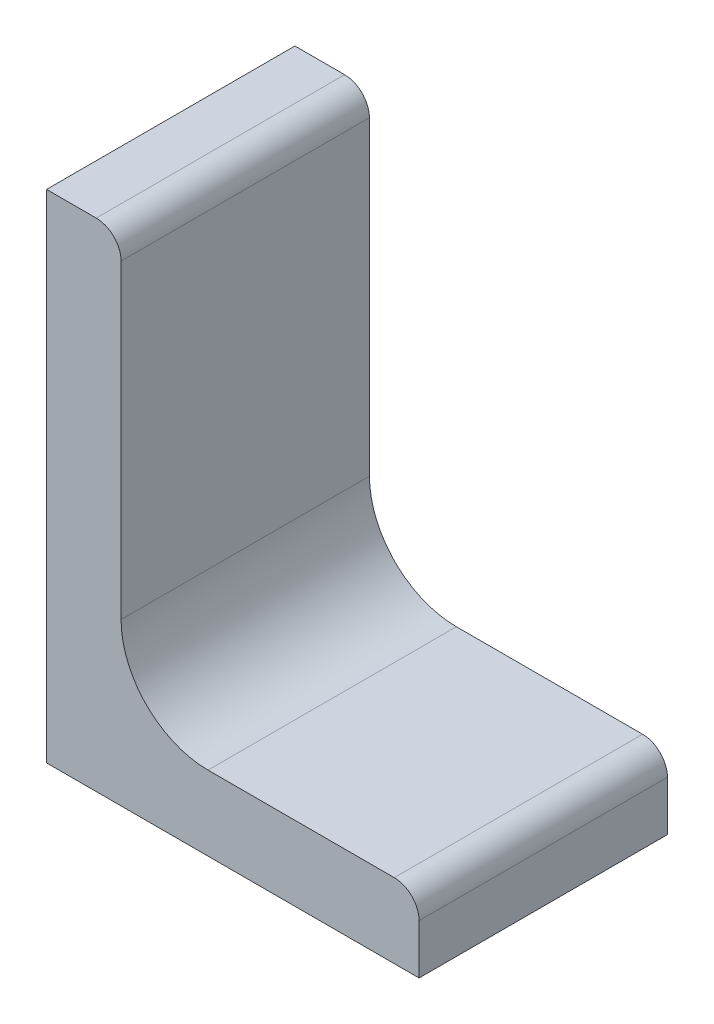
ISO-10303-21;
HEADER;
FILE_DESCRIPTION(('STEP AP214'),'2;1');
FILE_NAME('part.step','',(''),(''),'','','');
FILE_SCHEMA(('AUTOMOTIVE_DESIGN { 1 0 10303 214 1 1 1 1 }'));
ENDSEC;
DATA;
#1=APPLICATION_CONTEXT('core data for automotive mechanical design processes');
#2=APPLICATION_PROTOCOL_DEFINITION('international standard','automotive_design',2000,#1);
#3=PRODUCT_CONTEXT('',#1,'mechanical');
#4=PRODUCT('Part','Part','',(#3));
#5=PRODUCT_RELATED_PRODUCT_CATEGORY('part','',(#4));
#6=PRODUCT_DEFINITION_FORMATION('','',#4);
#7=PRODUCT_DEFINITION_CONTEXT('part definition',#1,'design');
#8=PRODUCT_DEFINITION('design','',#6,#7);
#9=PRODUCT_DEFINITION_SHAPE('','',#8);
#10=(LENGTH_UNIT() NAMED_UNIT(*) SI_UNIT(.MILLI.,.METRE.));
#11=(NAMED_UNIT(*) PLANE_ANGLE_UNIT() SI_UNIT($,.RADIAN.));
#12=(NAMED_UNIT(*) SI_UNIT($,.STERADIAN.) SOLID_ANGLE_UNIT());
#13=UNCERTAINTY_MEASURE_WITH_UNIT(LENGTH_MEASURE(1.E-05),#10,'distance_accuracy_value','');
#14=(GEOMETRIC_REPRESENTATION_CONTEXT(3) GLOBAL_UNCERTAINTY_ASSIGNED_CONTEXT((#13)) GLOBAL_UNIT_ASSIGNED_CONTEXT((#10,
#11,#12)) REPRESENTATION_CONTEXT('',''));
#15=CARTESIAN_POINT('',(0.,0.,0.));
#16=DIRECTION('',(0.,0.,1.));
#17=DIRECTION('',(1.,0.,0.));
#18=AXIS2_PLACEMENT_3D('',#15,#16,#17);
#19=CARTESIAN_POINT('',(3.,20.,10.));
#20=DIRECTION('',(0.,1.,0.));
#21=DIRECTION('',(0.,0.,1.));
#22=AXIS2_PLACEMENT_3D('',#19,#20,#21);
#23=PLANE('',#22);
#24=DIRECTION('',(1.,0.,0.));
#25=VECTOR('',#24,1.);
#26=CARTESIAN_POINT('',(3.,20.,10.));
#27=LINE('',#26,#25);
#28=CARTESIAN_POINT('',(0.,20.,10.));
#29=VERTEX_POINT('',#28);
#30=CARTESIAN_POINT('',(2.,20.,10.));
#31=VERTEX_POINT('',#30);
#32=EDGE_CURVE('E148',#29,#31,#27,.T.);
#33=ORIENTED_EDGE('',*,*,#32,.T.);
#34=DIRECTION('',(0.,0.,-1.));
#35=VECTOR('',#34,1.);
#36=CARTESIAN_POINT('',(2.,20.,10.));
#37=LINE('',#36,#35);
#38=CARTESIAN_POINT('',(2.,20.,0.));
#39=VERTEX_POINT('',#38);
#40=EDGE_CURVE('E164',#31,#39,#37,.T.);
#41=ORIENTED_EDGE('',*,*,#40,.T.);
#42=DIRECTION('',(1.,0.,0.));
#43=VECTOR('',#42,1.);
#44=CARTESIAN_POINT('',(3.,20.,0.));
#45=LINE('',#44,#43);
#46=CARTESIAN_POINT('',(0.,20.,0.));
#47=VERTEX_POINT('',#46);
#48=EDGE_CURVE('E135',#47,#39,#45,.T.);
#49=ORIENTED_EDGE('',*,*,#48,.F.);
#50=DIRECTION('',(0.,0.,-1.));
#51=VECTOR('',#50,1.);
#52=CARTESIAN_POINT('',(0.,20.,10.));
#53=LINE('',#52,#51);
#54=EDGE_CURVE('E149',#29,#47,#53,.T.);
#55=ORIENTED_EDGE('',*,*,#54,.F.);
#56=EDGE_LOOP('',(#33,#41,#49,#55));
#57=FACE_BOUND('',#56,.T.);
#58=ADVANCED_FACE('F35',(#57),#23,.T.);
#59=CARTESIAN_POINT('',(0.,20.,10.));
#60=DIRECTION('',(-1.,0.,0.));
#61=DIRECTION('',(0.,-1.,0.));
#62=AXIS2_PLACEMENT_3D('',#59,#60,#61);
#63=PLANE('',#62);
#64=DIRECTION('',(0.,1.,0.));
#65=VECTOR('',#64,1.);
#66=CARTESIAN_POINT('',(0.,20.,0.));
#67=LINE('',#66,#65);
#68=CARTESIAN_POINT('',(0.,0.,0.));
#69=VERTEX_POINT('',#68);
#70=EDGE_CURVE('E145',#69,#47,#67,.T.);
#71=ORIENTED_EDGE('',*,*,#70,.F.);
#72=DIRECTION('',(0.,0.,-1.));
#73=VECTOR('',#72,1.);
#74=CARTESIAN_POINT('',(0.,0.,10.));
#75=LINE('',#74,#73);
#76=CARTESIAN_POINT('',(0.,0.,10.));
#77=VERTEX_POINT('',#76);
#78=EDGE_CURVE('E125',#77,#69,#75,.T.);
#79=ORIENTED_EDGE('',*,*,#78,.F.);
#80=DIRECTION('',(0.,1.,0.));
#81=VECTOR('',#80,1.);
#82=CARTESIAN_POINT('',(0.,20.,10.));
#83=LINE('',#82,#81);
#84=EDGE_CURVE('E126',#77,#29,#83,.T.);
#85=ORIENTED_EDGE('',*,*,#84,.T.);
#86=ORIENTED_EDGE('',*,*,#54,.T.);
#87=EDGE_LOOP('',(#71,#79,#85,#86));
#88=FACE_BOUND('',#87,.T.);
#89=ADVANCED_FACE('F202',(#88),#63,.T.);
#90=CARTESIAN_POINT('',(0.,0.,10.));
#91=DIRECTION('',(0.,-1.,0.));
#92=DIRECTION('',(1.,0.,0.));
#93=AXIS2_PLACEMENT_3D('',#90,#91,#92);
#94=PLANE('',#93);
#95=DIRECTION('',(-1.,0.,0.));
#96=VECTOR('',#95,1.);
#97=CARTESIAN_POINT('',(0.,0.,0.));
#98=LINE('',#97,#96);
#99=CARTESIAN_POINT('',(15.,0.,0.));
#100=VERTEX_POINT('',#99);
#101=EDGE_CURVE('E124',#100,#69,#98,.T.);
#102=ORIENTED_EDGE('',*,*,#101,.F.);
#103=DIRECTION('',(0.,0.,-1.));
#104=VECTOR('',#103,1.);
#105=CARTESIAN_POINT('',(15.,0.,10.));
#106=LINE('',#105,#104);
#107=CARTESIAN_POINT('',(15.,0.,10.));
#108=VERTEX_POINT('',#107);
#109=EDGE_CURVE('E108',#108,#100,#106,.T.);
#110=ORIENTED_EDGE('',*,*,#109,.F.);
#111=DIRECTION('',(-1.,0.,0.));
#112=VECTOR('',#111,1.);
#113=CARTESIAN_POINT('',(0.,0.,10.));
#114=LINE('',#113,#112);
#115=EDGE_CURVE('E116',#108,#77,#114,.T.);
#116=ORIENTED_EDGE('',*,*,#115,.T.);
#117=ORIENTED_EDGE('',*,*,#78,.T.);
#118=EDGE_LOOP('',(#102,#110,#116,#117));
#119=FACE_BOUND('',#118,.T.);
#120=ADVANCED_FACE('F121',(#119),#94,.T.);
#121=CARTESIAN_POINT('',(15.,0.,10.));
#122=DIRECTION('',(1.,0.,0.));
#123=DIRECTION('',(0.,0.,-1.));
#124=AXIS2_PLACEMENT_3D('',#121,#122,#123);
#125=PLANE('',#124);
#126=DIRECTION('',(0.,-1.,0.));
#127=VECTOR('',#126,1.);
#128=CARTESIAN_POINT('',(15.,0.,0.));
#129=LINE('',#128,#127);
#130=CARTESIAN_POINT('',(15.,2.,0.));
#131=VERTEX_POINT('',#130);
#132=EDGE_CURVE('E142',#131,#100,#129,.T.);
#133=ORIENTED_EDGE('',*,*,#132,.F.);
#134=DIRECTION('',(0.,0.,-1.));
#135=VECTOR('',#134,1.);
#136=CARTESIAN_POINT('',(15.,2.,10.));
#137=LINE('',#136,#135);
#138=CARTESIAN_POINT('',(15.,2.,10.));
#139=VERTEX_POINT('',#138);
#140=EDGE_CURVE('E111',#131,#139,#137,.F.);
#141=ORIENTED_EDGE('',*,*,#140,.T.);
#142=DIRECTION('',(0.,-1.,0.));
#143=VECTOR('',#142,1.);
#144=CARTESIAN_POINT('',(15.,0.,10.));
#145=LINE('',#144,#143);
#146=EDGE_CURVE('E104',#139,#108,#145,.T.);
#147=ORIENTED_EDGE('',*,*,#146,.T.);
#148=ORIENTED_EDGE('',*,*,#109,.T.);
#149=EDGE_LOOP('',(#133,#141,#147,#148));
#150=FACE_BOUND('',#149,.T.);
#151=ADVANCED_FACE('F107',(#150),#125,.T.);
#152=CARTESIAN_POINT('',(15.,3.,10.));
#153=DIRECTION('',(0.,1.,0.));
#154=DIRECTION('',(-1.,0.,0.));
#155=AXIS2_PLACEMENT_3D('',#152,#153,#154);
#156=PLANE('',#155);
#157=DIRECTION('',(1.,0.,0.));
#158=VECTOR('',#157,1.);
#159=CARTESIAN_POINT('',(15.,3.,0.));
#160=LINE('',#159,#158);
#161=CARTESIAN_POINT('',(6.5,3.,0.));
#162=VERTEX_POINT('',#161);
#163=CARTESIAN_POINT('',(14.,3.,0.));
#164=VERTEX_POINT('',#163);
#165=EDGE_CURVE('E140',#162,#164,#160,.T.);
#166=ORIENTED_EDGE('',*,*,#165,.F.);
#167=DIRECTION('',(0.,0.,-1.));
#168=VECTOR('',#167,1.);
#169=CARTESIAN_POINT('',(6.5,3.,10.));
#170=LINE('',#169,#168);
#171=CARTESIAN_POINT('',(6.5,3.,10.));
#172=VERTEX_POINT('',#171);
#173=EDGE_CURVE('E56',#162,#172,#170,.F.);
#174=ORIENTED_EDGE('',*,*,#173,.T.);
#175=DIRECTION('',(1.,0.,0.));
#176=VECTOR('',#175,1.);
#177=CARTESIAN_POINT('',(15.,3.,10.));
#178=LINE('',#177,#176);
#179=CARTESIAN_POINT('',(14.,3.,10.));
#180=VERTEX_POINT('',#179);
#181=EDGE_CURVE('E117',#172,#180,#178,.T.);
#182=ORIENTED_EDGE('',*,*,#181,.T.);
#183=DIRECTION('',(0.,0.,-1.));
#184=VECTOR('',#183,1.);
#185=CARTESIAN_POINT('',(14.,3.,10.));
#186=LINE('',#185,#184);
#187=EDGE_CURVE('E151',#180,#164,#186,.T.);
#188=ORIENTED_EDGE('',*,*,#187,.T.);
#189=EDGE_LOOP('',(#166,#174,#182,#188));
#190=FACE_BOUND('',#189,.T.);
#191=ADVANCED_FACE('F192',(#190),#156,.T.);
#192=CARTESIAN_POINT('',(3.,3.,10.));
#193=DIRECTION('',(1.,0.,0.));
#194=DIRECTION('',(0.,1.,0.));
#195=AXIS2_PLACEMENT_3D('',#192,#193,#194);
#196=PLANE('',#195);
#197=DIRECTION('',(0.,-1.,0.));
#198=VECTOR('',#197,1.);
#199=CARTESIAN_POINT('',(3.,3.,10.));
#200=LINE('',#199,#198);
#201=CARTESIAN_POINT('',(3.,19.,10.));
#202=VERTEX_POINT('',#201);
#203=CARTESIAN_POINT('',(3.,6.5,10.));
#204=VERTEX_POINT('',#203);
#205=EDGE_CURVE('E179',#202,#204,#200,.T.);
#206=ORIENTED_EDGE('',*,*,#205,.T.);
#207=DIRECTION('',(0.,0.,-1.));
#208=VECTOR('',#207,1.);
#209=CARTESIAN_POINT('',(3.,6.5,0.));
#210=LINE('',#209,#208);
#211=CARTESIAN_POINT('',(3.,6.5,0.));
#212=VERTEX_POINT('',#211);
#213=EDGE_CURVE('E169',#204,#212,#210,.T.);
#214=ORIENTED_EDGE('',*,*,#213,.T.);
#215=DIRECTION('',(0.,-1.,0.));
#216=VECTOR('',#215,1.);
#217=CARTESIAN_POINT('',(3.,3.,0.));
#218=LINE('',#217,#216);
#219=CARTESIAN_POINT('',(3.,19.,0.));
#220=VERTEX_POINT('',#219);
#221=EDGE_CURVE('E138',#220,#212,#218,.T.);
#222=ORIENTED_EDGE('',*,*,#221,.F.);
#223=DIRECTION('',(0.,0.,-1.));
#224=VECTOR('',#223,1.);
#225=CARTESIAN_POINT('',(3.,19.,10.));
#226=LINE('',#225,#224);
#227=EDGE_CURVE('E167',#220,#202,#226,.F.);
#228=ORIENTED_EDGE('',*,*,#227,.T.);
#229=EDGE_LOOP('',(#206,#214,#222,#228));
#230=FACE_BOUND('',#229,.T.);
#231=ADVANCED_FACE('F176',(#230),#196,.T.);
#232=CARTESIAN_POINT('',(0.,20.,10.));
#233=DIRECTION('',(0.,0.,1.));
#234=DIRECTION('',(1.,0.,0.));
#235=AXIS2_PLACEMENT_3D('',#232,#233,#234);
#236=PLANE('',#235);
#237=ORIENTED_EDGE('',*,*,#146,.F.);
#238=CARTESIAN_POINT('',(14.,2.,10.));
#239=DIRECTION('',(0.,0.,1.));
#240=DIRECTION('',(1.,0.,0.));
#241=AXIS2_PLACEMENT_3D('',#238,#239,#240);
#242=CIRCLE('',#241,1.);
#243=EDGE_CURVE('E162',#139,#180,#242,.T.);
#244=ORIENTED_EDGE('',*,*,#243,.T.);
#245=ORIENTED_EDGE('',*,*,#181,.F.);
#246=CARTESIAN_POINT('',(6.5,6.5,10.));
#247=DIRECTION('',(0.,0.,1.));
#248=DIRECTION('',(1.,0.,0.));
#249=AXIS2_PLACEMENT_3D('',#246,#247,#248);
#250=CIRCLE('',#249,3.5);
#251=EDGE_CURVE('E11',#172,#204,#250,.F.);
#252=ORIENTED_EDGE('',*,*,#251,.T.);
#253=ORIENTED_EDGE('',*,*,#205,.F.);
#254=CARTESIAN_POINT('',(2.,19.,10.));
#255=DIRECTION('',(0.,0.,1.));
#256=DIRECTION('',(1.,0.,0.));
#257=AXIS2_PLACEMENT_3D('',#254,#255,#256);
#258=CIRCLE('',#257,1.);
#259=EDGE_CURVE('E160',#202,#31,#258,.T.);
#260=ORIENTED_EDGE('',*,*,#259,.T.);
#261=ORIENTED_EDGE('',*,*,#32,.F.);
#262=ORIENTED_EDGE('',*,*,#84,.F.);
#263=ORIENTED_EDGE('',*,*,#115,.F.);
#264=EDGE_LOOP('',(#237,#244,#245,#252,#253,#260,#261,#262,#263));
#265=FACE_BOUND('',#264,.T.);
#266=ADVANCED_FACE('F128',(#265),#236,.T.);
#267=CARTESIAN_POINT('',(0.,20.,0.));
#268=DIRECTION('',(0.,0.,1.));
#269=DIRECTION('',(1.,0.,0.));
#270=AXIS2_PLACEMENT_3D('',#267,#268,#269);
#271=PLANE('',#270);
#272=ORIENTED_EDGE('',*,*,#221,.T.);
#273=CARTESIAN_POINT('',(6.5,6.5,0.));
#274=DIRECTION('',(0.,0.,1.));
#275=DIRECTION('',(1.,0.,0.));
#276=AXIS2_PLACEMENT_3D('',#273,#274,#275);
#277=CIRCLE('',#276,3.5);
#278=EDGE_CURVE('E43',#212,#162,#277,.T.);
#279=ORIENTED_EDGE('',*,*,#278,.T.);
#280=ORIENTED_EDGE('',*,*,#165,.T.);
#281=CARTESIAN_POINT('',(14.,2.,0.));
#282=DIRECTION('',(0.,0.,1.));
#283=DIRECTION('',(1.,0.,0.));
#284=AXIS2_PLACEMENT_3D('',#281,#282,#283);
#285=CIRCLE('',#284,1.);
#286=EDGE_CURVE('E157',#164,#131,#285,.F.);
#287=ORIENTED_EDGE('',*,*,#286,.T.);
#288=ORIENTED_EDGE('',*,*,#132,.T.);
#289=ORIENTED_EDGE('',*,*,#101,.T.);
#290=ORIENTED_EDGE('',*,*,#70,.T.);
#291=ORIENTED_EDGE('',*,*,#48,.T.);
#292=CARTESIAN_POINT('',(2.,19.,0.));
#293=DIRECTION('',(0.,0.,1.));
#294=DIRECTION('',(1.,0.,0.));
#295=AXIS2_PLACEMENT_3D('',#292,#293,#294);
#296=CIRCLE('',#295,1.);
#297=EDGE_CURVE('E155',#39,#220,#296,.F.);
#298=ORIENTED_EDGE('',*,*,#297,.T.);
#299=EDGE_LOOP('',(#272,#279,#280,#287,#288,#289,#290,#291,#298));
#300=FACE_BOUND('',#299,.T.);
#301=ADVANCED_FACE('F182',(#300),#271,.F.);
#302=CARTESIAN_POINT('',(14.,2.,10.));
#303=DIRECTION('',(0.,0.,-1.));
#304=DIRECTION('',(-1.,0.,0.));
#305=AXIS2_PLACEMENT_3D('',#302,#303,#304);
#306=CYLINDRICAL_SURFACE('',#305,1.);
#307=ORIENTED_EDGE('',*,*,#243,.F.);
#308=ORIENTED_EDGE('',*,*,#140,.F.);
#309=ORIENTED_EDGE('',*,*,#286,.F.);
#310=ORIENTED_EDGE('',*,*,#187,.F.);
#311=EDGE_LOOP('',(#307,#308,#309,#310));
#312=FACE_BOUND('',#311,.T.);
#313=ADVANCED_FACE('F196',(#312),#306,.T.);
#314=CARTESIAN_POINT('',(2.,19.,10.));
#315=DIRECTION('',(0.,0.,-1.));
#316=DIRECTION('',(-1.,0.,0.));
#317=AXIS2_PLACEMENT_3D('',#314,#315,#316);
#318=CYLINDRICAL_SURFACE('',#317,1.);
#319=ORIENTED_EDGE('',*,*,#259,.F.);
#320=ORIENTED_EDGE('',*,*,#227,.F.);
#321=ORIENTED_EDGE('',*,*,#297,.F.);
#322=ORIENTED_EDGE('',*,*,#40,.F.);
#323=EDGE_LOOP('',(#319,#320,#321,#322));
#324=FACE_BOUND('',#323,.T.);
#325=ADVANCED_FACE('F187',(#324),#318,.T.);
#326=CARTESIAN_POINT('',(6.5,6.5,10.));
#327=DIRECTION('',(0.,0.,1.));
#328=DIRECTION('',(1.,0.,0.));
#329=AXIS2_PLACEMENT_3D('',#326,#327,#328);
#330=CYLINDRICAL_SURFACE('',#329,3.5);
#331=ORIENTED_EDGE('',*,*,#251,.F.);
#332=ORIENTED_EDGE('',*,*,#173,.F.);
#333=ORIENTED_EDGE('',*,*,#278,.F.);
#334=ORIENTED_EDGE('',*,*,#213,.F.);
#335=EDGE_LOOP('',(#331,#332,#333,#334));
#336=FACE_BOUND('',#335,.T.);
#337=ADVANCED_FACE('F37',(#336),#330,.F.);
#338=CLOSED_SHELL('',(#58,#89,#120,#151,#191,#231,#266,#301,#313,#325,#337));
#339=MANIFOLD_SOLID_BREP('B2',#338);
#340=ADVANCED_BREP_SHAPE_REPRESENTATION('',(#18,#339),#14);
#341=SHAPE_DEFINITION_REPRESENTATION(#9,#340);
ENDSEC;
END-ISO-10303-21;
